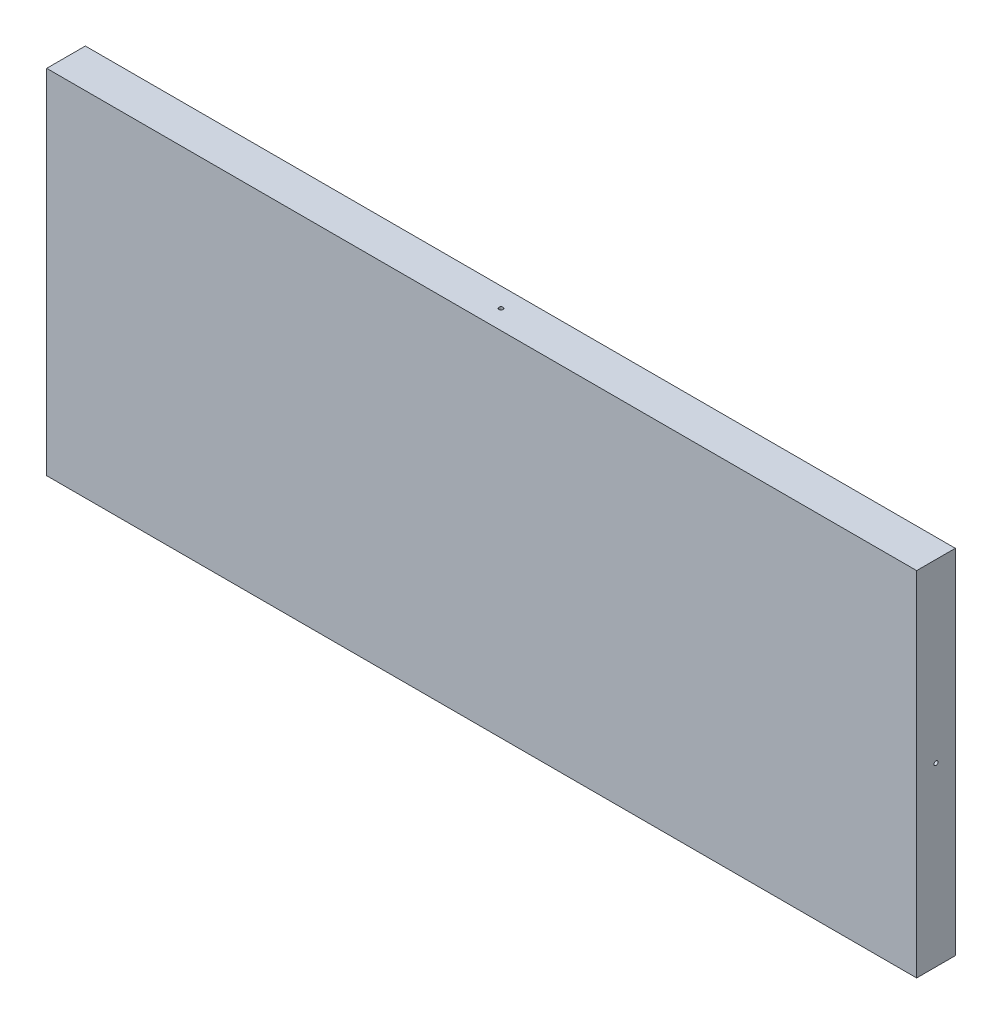
ISO-10303-21;
HEADER;
FILE_DESCRIPTION(('STEP AP214'),'2;1');
FILE_NAME('part.step','',(''),(''),'','','');
FILE_SCHEMA(('AUTOMOTIVE_DESIGN { 1 0 10303 214 1 1 1 1 }'));
ENDSEC;
DATA;
#1=APPLICATION_CONTEXT('core data for automotive mechanical design processes');
#2=APPLICATION_PROTOCOL_DEFINITION('international standard','automotive_design',2000,#1);
#3=PRODUCT_CONTEXT('',#1,'mechanical');
#4=PRODUCT('Part','Part','',(#3));
#5=PRODUCT_RELATED_PRODUCT_CATEGORY('part','',(#4));
#6=PRODUCT_DEFINITION_FORMATION('','',#4);
#7=PRODUCT_DEFINITION_CONTEXT('part definition',#1,'design');
#8=PRODUCT_DEFINITION('design','',#6,#7);
#9=PRODUCT_DEFINITION_SHAPE('','',#8);
#10=(LENGTH_UNIT() NAMED_UNIT(*) SI_UNIT(.MILLI.,.METRE.));
#11=(NAMED_UNIT(*) PLANE_ANGLE_UNIT() SI_UNIT($,.RADIAN.));
#12=(NAMED_UNIT(*) SI_UNIT($,.STERADIAN.) SOLID_ANGLE_UNIT());
#13=UNCERTAINTY_MEASURE_WITH_UNIT(LENGTH_MEASURE(1.E-05),#10,'distance_accuracy_value','');
#14=(GEOMETRIC_REPRESENTATION_CONTEXT(3) GLOBAL_UNCERTAINTY_ASSIGNED_CONTEXT((#13)) GLOBAL_UNIT_ASSIGNED_CONTEXT((#10,
#11,#12)) REPRESENTATION_CONTEXT('',''));
#15=CARTESIAN_POINT('',(0.,0.,0.));
#16=DIRECTION('',(0.,0.,1.));
#17=DIRECTION('',(1.,0.,0.));
#18=AXIS2_PLACEMENT_3D('',#15,#16,#17);
#19=CARTESIAN_POINT('',(1.11022302462516E-13,182.5,20.));
#20=DIRECTION('',(0.,1.,0.));
#21=DIRECTION('',(0.,0.,1.));
#22=AXIS2_PLACEMENT_3D('',#19,#20,#21);
#23=CYLINDRICAL_SURFACE('',#22,2.09999999999997);
#24=CARTESIAN_POINT('',(1.11022302462516E-13,182.5,20.));
#25=DIRECTION('',(0.,1.,0.));
#26=DIRECTION('',(0.,0.,1.));
#27=AXIS2_PLACEMENT_3D('',#24,#25,#26);
#28=CIRCLE('',#27,2.09999999999999);
#29=CARTESIAN_POINT('',(1.11022302462516E-13,182.5,22.1));
#30=VERTEX_POINT('',#29);
#31=EDGE_CURVE('E156',#30,#30,#28,.T.);
#32=ORIENTED_EDGE('',*,*,#31,.T.);
#33=EDGE_LOOP('',(#32));
#34=FACE_BOUND('',#33,.T.);
#35=CARTESIAN_POINT('',(1.11022302462516E-13,-1.17485929660676E-13,20.));
#36=DIRECTION('',(0.707106781186547,0.707106781186547,0.));
#37=DIRECTION('',(-0.707106781186547,0.707106781186547,0.));
#38=AXIS2_PLACEMENT_3D('',#35,#36,#37);
#39=ELLIPSE('',#38,2.96984848098343,2.09999999999995);
#40=CARTESIAN_POINT('',(1.11022302462516E-13,-1.17485929660676E-13,22.1));
#41=VERTEX_POINT('',#40);
#42=CARTESIAN_POINT('',(1.11022302462516E-13,-1.17485929660676E-13,17.9));
#43=VERTEX_POINT('',#42);
#44=EDGE_CURVE('E59',#41,#43,#39,.F.);
#45=ORIENTED_EDGE('',*,*,#44,.T.);
#46=CARTESIAN_POINT('',(1.11022302462516E-13,-1.17485929660676E-13,20.));
#47=DIRECTION('',(-0.707106781186547,0.707106781186547,0.));
#48=DIRECTION('',(0.707106781186547,0.707106781186547,0.));
#49=AXIS2_PLACEMENT_3D('',#46,#47,#48);
#50=ELLIPSE('',#49,2.96984848098343,2.09999999999995);
#51=EDGE_CURVE('E11',#43,#41,#50,.F.);
#52=ORIENTED_EDGE('',*,*,#51,.T.);
#53=EDGE_LOOP('',(#45,#52));
#54=FACE_BOUND('',#53,.T.);
#55=ADVANCED_FACE('F45',(#34,#54),#23,.F.);
#56=CARTESIAN_POINT('',(450.,182.5,40.));
#57=DIRECTION('',(-1.,0.,0.));
#58=DIRECTION('',(0.,-1.,0.));
#59=AXIS2_PLACEMENT_3D('',#56,#57,#58);
#60=PLANE('',#59);
#61=CARTESIAN_POINT('',(450.,-1.23949556858836E-13,20.));
#62=DIRECTION('',(-1.,0.,0.));
#63=DIRECTION('',(0.,0.,1.));
#64=AXIS2_PLACEMENT_3D('',#61,#62,#63);
#65=CIRCLE('',#64,2.09999999999989);
#66=CARTESIAN_POINT('',(450.,-1.23949556858836E-13,22.0999999999999));
#67=VERTEX_POINT('',#66);
#68=EDGE_CURVE('E160',#67,#67,#65,.T.);
#69=ORIENTED_EDGE('',*,*,#68,.T.);
#70=EDGE_LOOP('',(#69));
#71=FACE_BOUND('',#70,.T.);
#72=DIRECTION('',(0.,1.,0.));
#73=VECTOR('',#72,1.);
#74=CARTESIAN_POINT('',(450.,182.5,0.));
#75=LINE('',#74,#73);
#76=CARTESIAN_POINT('',(450.,-182.5,0.));
#77=VERTEX_POINT('',#76);
#78=CARTESIAN_POINT('',(450.,182.5,0.));
#79=VERTEX_POINT('',#78);
#80=EDGE_CURVE('E139',#77,#79,#75,.T.);
#81=ORIENTED_EDGE('',*,*,#80,.T.);
#82=DIRECTION('',(0.,0.,-1.));
#83=VECTOR('',#82,1.);
#84=CARTESIAN_POINT('',(450.,182.5,40.));
#85=LINE('',#84,#83);
#86=CARTESIAN_POINT('',(450.,182.5,40.));
#87=VERTEX_POINT('',#86);
#88=EDGE_CURVE('E112',#87,#79,#85,.T.);
#89=ORIENTED_EDGE('',*,*,#88,.F.);
#90=DIRECTION('',(0.,1.,0.));
#91=VECTOR('',#90,1.);
#92=CARTESIAN_POINT('',(450.,182.5,40.));
#93=LINE('',#92,#91);
#94=CARTESIAN_POINT('',(450.,-182.5,40.));
#95=VERTEX_POINT('',#94);
#96=EDGE_CURVE('E132',#95,#87,#93,.T.);
#97=ORIENTED_EDGE('',*,*,#96,.F.);
#98=DIRECTION('',(0.,0.,-1.));
#99=VECTOR('',#98,1.);
#100=CARTESIAN_POINT('',(450.,-182.5,40.));
#101=LINE('',#100,#99);
#102=EDGE_CURVE('E127',#95,#77,#101,.T.);
#103=ORIENTED_EDGE('',*,*,#102,.T.);
#104=EDGE_LOOP('',(#81,#89,#97,#103));
#105=FACE_BOUND('',#104,.T.);
#106=ADVANCED_FACE('F47',(#71,#105),#60,.F.);
#107=CARTESIAN_POINT('',(-450.,182.5,40.));
#108=DIRECTION('',(0.,-1.,0.));
#109=DIRECTION('',(0.,0.,-1.));
#110=AXIS2_PLACEMENT_3D('',#107,#108,#109);
#111=PLANE('',#110);
#112=ORIENTED_EDGE('',*,*,#31,.F.);
#113=EDGE_LOOP('',(#112));
#114=FACE_BOUND('',#113,.T.);
#115=DIRECTION('',(-1.,0.,0.));
#116=VECTOR('',#115,1.);
#117=CARTESIAN_POINT('',(-450.,182.5,0.));
#118=LINE('',#117,#116);
#119=CARTESIAN_POINT('',(-450.,182.5,0.));
#120=VERTEX_POINT('',#119);
#121=EDGE_CURVE('E136',#79,#120,#118,.T.);
#122=ORIENTED_EDGE('',*,*,#121,.T.);
#123=DIRECTION('',(0.,0.,-1.));
#124=VECTOR('',#123,1.);
#125=CARTESIAN_POINT('',(-450.,182.5,40.));
#126=LINE('',#125,#124);
#127=CARTESIAN_POINT('',(-450.,182.5,40.));
#128=VERTEX_POINT('',#127);
#129=EDGE_CURVE('E120',#128,#120,#126,.T.);
#130=ORIENTED_EDGE('',*,*,#129,.F.);
#131=DIRECTION('',(-1.,0.,0.));
#132=VECTOR('',#131,1.);
#133=CARTESIAN_POINT('',(-450.,182.5,40.));
#134=LINE('',#133,#132);
#135=EDGE_CURVE('E97',#87,#128,#134,.T.);
#136=ORIENTED_EDGE('',*,*,#135,.F.);
#137=ORIENTED_EDGE('',*,*,#88,.T.);
#138=EDGE_LOOP('',(#122,#130,#136,#137));
#139=FACE_BOUND('',#138,.T.);
#140=ADVANCED_FACE('F174',(#114,#139),#111,.F.);
#141=CARTESIAN_POINT('',(-450.,182.5,40.));
#142=DIRECTION('',(1.,0.,0.));
#143=DIRECTION('',(0.,1.,0.));
#144=AXIS2_PLACEMENT_3D('',#141,#142,#143);
#145=PLANE('',#144);
#146=CARTESIAN_POINT('',(-450.,-1.23949556858836E-13,20.));
#147=DIRECTION('',(-1.,0.,0.));
#148=DIRECTION('',(0.,0.,1.));
#149=AXIS2_PLACEMENT_3D('',#146,#147,#148);
#150=CIRCLE('',#149,2.09999999999999);
#151=CARTESIAN_POINT('',(-450.,-1.23949556858836E-13,22.1));
#152=VERTEX_POINT('',#151);
#153=EDGE_CURVE('E164',#152,#152,#150,.T.);
#154=ORIENTED_EDGE('',*,*,#153,.F.);
#155=EDGE_LOOP('',(#154));
#156=FACE_BOUND('',#155,.T.);
#157=DIRECTION('',(0.,-1.,0.));
#158=VECTOR('',#157,1.);
#159=CARTESIAN_POINT('',(-450.,182.5,0.));
#160=LINE('',#159,#158);
#161=CARTESIAN_POINT('',(-450.,-182.5,0.));
#162=VERTEX_POINT('',#161);
#163=EDGE_CURVE('E133',#120,#162,#160,.T.);
#164=ORIENTED_EDGE('',*,*,#163,.T.);
#165=DIRECTION('',(0.,0.,-1.));
#166=VECTOR('',#165,1.);
#167=CARTESIAN_POINT('',(-450.,-182.5,40.));
#168=LINE('',#167,#166);
#169=CARTESIAN_POINT('',(-450.,-182.5,40.));
#170=VERTEX_POINT('',#169);
#171=EDGE_CURVE('E124',#170,#162,#168,.T.);
#172=ORIENTED_EDGE('',*,*,#171,.F.);
#173=DIRECTION('',(0.,-1.,0.));
#174=VECTOR('',#173,1.);
#175=CARTESIAN_POINT('',(-450.,182.5,40.));
#176=LINE('',#175,#174);
#177=EDGE_CURVE('E146',#128,#170,#176,.T.);
#178=ORIENTED_EDGE('',*,*,#177,.F.);
#179=ORIENTED_EDGE('',*,*,#129,.T.);
#180=EDGE_LOOP('',(#164,#172,#178,#179));
#181=FACE_BOUND('',#180,.T.);
#182=ADVANCED_FACE('F170',(#156,#181),#145,.F.);
#183=CARTESIAN_POINT('',(-450.,-182.5,40.));
#184=DIRECTION('',(0.,1.,0.));
#185=DIRECTION('',(0.,0.,1.));
#186=AXIS2_PLACEMENT_3D('',#183,#184,#185);
#187=PLANE('',#186);
#188=CARTESIAN_POINT('',(1.11022302462516E-13,-182.5,20.));
#189=DIRECTION('',(0.,1.,0.));
#190=DIRECTION('',(0.,0.,1.));
#191=AXIS2_PLACEMENT_3D('',#188,#189,#190);
#192=CIRCLE('',#191,2.09999999999995);
#193=CARTESIAN_POINT('',(1.11022302462516E-13,-182.5,22.1));
#194=VERTEX_POINT('',#193);
#195=EDGE_CURVE('E143',#194,#194,#192,.T.);
#196=ORIENTED_EDGE('',*,*,#195,.T.);
#197=EDGE_LOOP('',(#196));
#198=FACE_BOUND('',#197,.T.);
#199=DIRECTION('',(1.,0.,0.));
#200=VECTOR('',#199,1.);
#201=CARTESIAN_POINT('',(-450.,-182.5,0.));
#202=LINE('',#201,#200);
#203=EDGE_CURVE('E89',#162,#77,#202,.T.);
#204=ORIENTED_EDGE('',*,*,#203,.T.);
#205=ORIENTED_EDGE('',*,*,#102,.F.);
#206=DIRECTION('',(1.,0.,0.));
#207=VECTOR('',#206,1.);
#208=CARTESIAN_POINT('',(-450.,-182.5,40.));
#209=LINE('',#208,#207);
#210=EDGE_CURVE('E68',#170,#95,#209,.T.);
#211=ORIENTED_EDGE('',*,*,#210,.F.);
#212=ORIENTED_EDGE('',*,*,#171,.T.);
#213=EDGE_LOOP('',(#204,#205,#211,#212));
#214=FACE_BOUND('',#213,.T.);
#215=ADVANCED_FACE('F173',(#198,#214),#187,.F.);
#216=CARTESIAN_POINT('',(0.,0.,40.));
#217=DIRECTION('',(0.,0.,1.));
#218=DIRECTION('',(1.,0.,0.));
#219=AXIS2_PLACEMENT_3D('',#216,#217,#218);
#220=PLANE('',#219);
#221=ORIENTED_EDGE('',*,*,#96,.T.);
#222=ORIENTED_EDGE('',*,*,#135,.T.);
#223=ORIENTED_EDGE('',*,*,#177,.T.);
#224=ORIENTED_EDGE('',*,*,#210,.T.);
#225=EDGE_LOOP('',(#221,#222,#223,#224));
#226=FACE_BOUND('',#225,.T.);
#227=ADVANCED_FACE('F185',(#226),#220,.T.);
#228=CARTESIAN_POINT('',(0.,0.,0.));
#229=DIRECTION('',(0.,0.,1.));
#230=DIRECTION('',(1.,0.,0.));
#231=AXIS2_PLACEMENT_3D('',#228,#229,#230);
#232=PLANE('',#231);
#233=ORIENTED_EDGE('',*,*,#80,.F.);
#234=ORIENTED_EDGE('',*,*,#203,.F.);
#235=ORIENTED_EDGE('',*,*,#163,.F.);
#236=ORIENTED_EDGE('',*,*,#121,.F.);
#237=EDGE_LOOP('',(#233,#234,#235,#236));
#238=FACE_BOUND('',#237,.T.);
#239=ADVANCED_FACE('F181',(#238),#232,.F.);
#240=CARTESIAN_POINT('',(1.11022302462516E-13,-1.17485929660676E-13,20.));
#241=DIRECTION('',(0.707106781186547,0.707106781186547,0.));
#242=DIRECTION('',(-0.707106781186547,0.707106781186547,0.));
#243=AXIS2_PLACEMENT_3D('',#240,#241,#242);
#244=ELLIPSE('',#243,2.96984848098343,2.09999999999995);
#245=EDGE_CURVE('E103',#41,#43,#244,.T.);
#246=ORIENTED_EDGE('',*,*,#245,.T.);
#247=CARTESIAN_POINT('',(1.11022302462516E-13,-1.17485929660676E-13,20.));
#248=DIRECTION('',(-0.707106781186547,0.707106781186547,0.));
#249=DIRECTION('',(0.707106781186547,0.707106781186547,0.));
#250=AXIS2_PLACEMENT_3D('',#247,#248,#249);
#251=ELLIPSE('',#250,2.96984848098343,2.09999999999995);
#252=EDGE_CURVE('E54',#43,#41,#251,.T.);
#253=ORIENTED_EDGE('',*,*,#252,.T.);
#254=EDGE_LOOP('',(#246,#253));
#255=FACE_BOUND('',#254,.T.);
#256=ORIENTED_EDGE('',*,*,#195,.F.);
#257=EDGE_LOOP('',(#256));
#258=FACE_BOUND('',#257,.T.);
#259=ADVANCED_FACE('F114',(#255,#258),#23,.F.);
#260=CARTESIAN_POINT('',(-450.,-1.23949556858836E-13,20.));
#261=DIRECTION('',(-1.,0.,0.));
#262=DIRECTION('',(0.,0.,1.));
#263=AXIS2_PLACEMENT_3D('',#260,#261,#262);
#264=CYLINDRICAL_SURFACE('',#263,2.09999999999994);
#265=ORIENTED_EDGE('',*,*,#153,.T.);
#266=EDGE_LOOP('',(#265));
#267=FACE_BOUND('',#266,.T.);
#268=ORIENTED_EDGE('',*,*,#44,.F.);
#269=ORIENTED_EDGE('',*,*,#252,.F.);
#270=EDGE_LOOP('',(#268,#269));
#271=FACE_BOUND('',#270,.T.);
#272=ADVANCED_FACE('F110',(#267,#271),#264,.F.);
#273=ORIENTED_EDGE('',*,*,#68,.F.);
#274=EDGE_LOOP('',(#273));
#275=FACE_BOUND('',#274,.T.);
#276=ORIENTED_EDGE('',*,*,#245,.F.);
#277=ORIENTED_EDGE('',*,*,#51,.F.);
#278=EDGE_LOOP('',(#276,#277));
#279=FACE_BOUND('',#278,.T.);
#280=ADVANCED_FACE('F104',(#275,#279),#264,.F.);
#281=CLOSED_SHELL('',(#55,#106,#140,#182,#215,#227,#239,#259,#272,#280));
#282=MANIFOLD_SOLID_BREP('B2',#281);
#283=ADVANCED_BREP_SHAPE_REPRESENTATION('',(#18,#282),#14);
#284=SHAPE_DEFINITION_REPRESENTATION(#9,#283);
ENDSEC;
END-ISO-10303-21;
